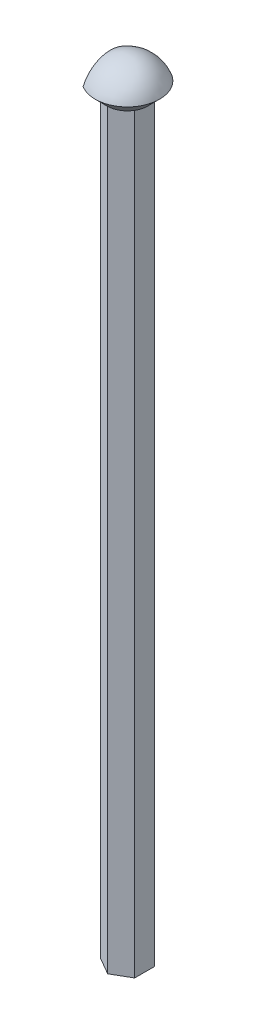
ISO-10303-21;
HEADER;
FILE_DESCRIPTION(('STEP AP214'),'2;1');
FILE_NAME('part.step','',(''),(''),'','','');
FILE_SCHEMA(('AUTOMOTIVE_DESIGN { 1 0 10303 214 1 1 1 1 }'));
ENDSEC;
DATA;
#1=APPLICATION_CONTEXT('core data for automotive mechanical design processes');
#2=APPLICATION_PROTOCOL_DEFINITION('international standard','automotive_design',2000,#1);
#3=PRODUCT_CONTEXT('',#1,'mechanical');
#4=PRODUCT('Part','Part','',(#3));
#5=PRODUCT_RELATED_PRODUCT_CATEGORY('part','',(#4));
#6=PRODUCT_DEFINITION_FORMATION('','',#4);
#7=PRODUCT_DEFINITION_CONTEXT('part definition',#1,'design');
#8=PRODUCT_DEFINITION('design','',#6,#7);
#9=PRODUCT_DEFINITION_SHAPE('','',#8);
#10=(LENGTH_UNIT() NAMED_UNIT(*) SI_UNIT(.MILLI.,.METRE.));
#11=(NAMED_UNIT(*) PLANE_ANGLE_UNIT() SI_UNIT($,.RADIAN.));
#12=(NAMED_UNIT(*) SI_UNIT($,.STERADIAN.) SOLID_ANGLE_UNIT());
#13=UNCERTAINTY_MEASURE_WITH_UNIT(LENGTH_MEASURE(1.E-05),#10,'distance_accuracy_value','');
#14=(GEOMETRIC_REPRESENTATION_CONTEXT(3) GLOBAL_UNCERTAINTY_ASSIGNED_CONTEXT((#13)) GLOBAL_UNIT_ASSIGNED_CONTEXT((#10,
#11,#12)) REPRESENTATION_CONTEXT('',''));
#15=CARTESIAN_POINT('',(0.,0.,0.));
#16=DIRECTION('',(0.,0.,1.));
#17=DIRECTION('',(1.,0.,0.));
#18=AXIS2_PLACEMENT_3D('',#15,#16,#17);
#19=CARTESIAN_POINT('',(3.17499999999997,139.7,-1.8330871046771));
#20=DIRECTION('',(-0.499999999999995,0.,0.866025403784442));
#21=DIRECTION('',(0.866025403784442,0.,0.499999999999995));
#22=AXIS2_PLACEMENT_3D('',#19,#20,#21);
#23=PLANE('',#22);
#24=DIRECTION('',(-0.866025403784441,0.,-0.499999999999995));
#25=VECTOR('',#24,1.);
#26=CARTESIAN_POINT('',(3.17499999999997,0.,-1.8330871046771));
#27=LINE('',#26,#25);
#28=CARTESIAN_POINT('',(3.17499999999997,0.,-1.8330871046771));
#29=VERTEX_POINT('',#28);
#30=CARTESIAN_POINT('',(0.,0.,-3.66617420935412));
#31=VERTEX_POINT('',#30);
#32=EDGE_CURVE('E152',#29,#31,#27,.T.);
#33=ORIENTED_EDGE('',*,*,#32,.T.);
#34=DIRECTION('',(0.,-1.,0.));
#35=VECTOR('',#34,1.);
#36=CARTESIAN_POINT('',(0.,139.7,-3.66617420935412));
#37=LINE('',#36,#35);
#38=CARTESIAN_POINT('',(0.,139.7,-3.66617420935412));
#39=VERTEX_POINT('',#38);
#40=EDGE_CURVE('E125',#39,#31,#37,.T.);
#41=ORIENTED_EDGE('',*,*,#40,.F.);
#42=DIRECTION('',(-0.866025403784441,0.,-0.499999999999995));
#43=VECTOR('',#42,1.);
#44=CARTESIAN_POINT('',(3.17499999999997,139.7,-1.8330871046771));
#45=LINE('',#44,#43);
#46=CARTESIAN_POINT('',(3.17499999999997,139.7,-1.8330871046771));
#47=VERTEX_POINT('',#46);
#48=EDGE_CURVE('E143',#47,#39,#45,.T.);
#49=ORIENTED_EDGE('',*,*,#48,.F.);
#50=DIRECTION('',(0.,-1.,0.));
#51=VECTOR('',#50,1.);
#52=CARTESIAN_POINT('',(3.17499999999997,139.7,-1.8330871046771));
#53=LINE('',#52,#51);
#54=EDGE_CURVE('E139',#47,#29,#53,.T.);
#55=ORIENTED_EDGE('',*,*,#54,.T.);
#56=EDGE_LOOP('',(#33,#41,#49,#55));
#57=FACE_BOUND('',#56,.T.);
#58=ADVANCED_FACE('F33',(#57),#23,.F.);
#59=CARTESIAN_POINT('',(0.,139.7,-3.66617420935412));
#60=DIRECTION('',(0.500000000000001,0.,0.866025403784438));
#61=DIRECTION('',(0.866025403784438,0.,-0.500000000000001));
#62=AXIS2_PLACEMENT_3D('',#59,#60,#61);
#63=PLANE('',#62);
#64=DIRECTION('',(-0.866025403784438,0.,0.500000000000001));
#65=VECTOR('',#64,1.);
#66=CARTESIAN_POINT('',(0.,0.,-3.66617420935412));
#67=LINE('',#66,#65);
#68=CARTESIAN_POINT('',(-3.175,0.,-1.83308710467705));
#69=VERTEX_POINT('',#68);
#70=EDGE_CURVE('E150',#31,#69,#67,.T.);
#71=ORIENTED_EDGE('',*,*,#70,.T.);
#72=DIRECTION('',(0.,-1.,0.));
#73=VECTOR('',#72,1.);
#74=CARTESIAN_POINT('',(-3.175,139.7,-1.83308710467705));
#75=LINE('',#74,#73);
#76=CARTESIAN_POINT('',(-3.175,139.7,-1.83308710467705));
#77=VERTEX_POINT('',#76);
#78=EDGE_CURVE('E127',#77,#69,#75,.T.);
#79=ORIENTED_EDGE('',*,*,#78,.F.);
#80=DIRECTION('',(-0.866025403784438,0.,0.500000000000001));
#81=VECTOR('',#80,1.);
#82=CARTESIAN_POINT('',(0.,139.7,-3.66617420935412));
#83=LINE('',#82,#81);
#84=EDGE_CURVE('E95',#39,#77,#83,.T.);
#85=ORIENTED_EDGE('',*,*,#84,.F.);
#86=ORIENTED_EDGE('',*,*,#40,.T.);
#87=EDGE_LOOP('',(#71,#79,#85,#86));
#88=FACE_BOUND('',#87,.T.);
#89=ADVANCED_FACE('F171',(#88),#63,.F.);
#90=CARTESIAN_POINT('',(-3.175,139.7,-1.83308710467705));
#91=DIRECTION('',(1.,0.,0.));
#92=DIRECTION('',(0.,0.,-1.));
#93=AXIS2_PLACEMENT_3D('',#90,#91,#92);
#94=PLANE('',#93);
#95=DIRECTION('',(0.,0.,1.));
#96=VECTOR('',#95,1.);
#97=CARTESIAN_POINT('',(-3.175,0.,-1.83308710467705));
#98=LINE('',#97,#96);
#99=CARTESIAN_POINT('',(-3.17499999999999,0.,1.83308710467707));
#100=VERTEX_POINT('',#99);
#101=EDGE_CURVE('E148',#69,#100,#98,.T.);
#102=ORIENTED_EDGE('',*,*,#101,.T.);
#103=DIRECTION('',(0.,-1.,0.));
#104=VECTOR('',#103,1.);
#105=CARTESIAN_POINT('',(-3.17499999999999,139.7,1.83308710467707));
#106=LINE('',#105,#104);
#107=CARTESIAN_POINT('',(-3.175,139.7,1.83308710467707));
#108=VERTEX_POINT('',#107);
#109=EDGE_CURVE('E132',#108,#100,#106,.T.);
#110=ORIENTED_EDGE('',*,*,#109,.F.);
#111=DIRECTION('',(0.,0.,-1.));
#112=VECTOR('',#111,1.);
#113=CARTESIAN_POINT('',(-3.175,139.7,0.));
#114=LINE('',#113,#112);
#115=CARTESIAN_POINT('',(-3.175,139.7,2.10605674187566));
#116=VERTEX_POINT('',#115);
#117=EDGE_CURVE('E53',#116,#108,#114,.T.);
#118=ORIENTED_EDGE('',*,*,#117,.F.);
#119=CARTESIAN_POINT('',(-3.175,149.142733211741,-12.8667910755397));
#120=CARTESIAN_POINT('',(-3.175,148.839290834502,-12.5542267812878));
#121=CARTESIAN_POINT('',(-3.175,148.53615547368,-12.2413633914042));
#122=CARTESIAN_POINT('',(-3.175,147.930699867798,-11.6148376192342));
#123=CARTESIAN_POINT('',(-3.175,147.628379638268,-11.3011752219432));
#124=CARTESIAN_POINT('',(-3.175,147.02447949178,-10.6725633026376));
#125=CARTESIAN_POINT('',(-3.175,146.722900553875,-10.3576128394072));
#126=CARTESIAN_POINT('',(-3.175,146.121086574898,-9.72643689569053));
#127=CARTESIAN_POINT('',(-3.175,145.820851517944,-9.41021143035687));
#128=CARTESIAN_POINT('',(-3.175,145.214506887757,-8.76797153920887));
#129=CARTESIAN_POINT('',(-3.175,144.90844338654,-8.4419135538011));
#130=CARTESIAN_POINT('',(-3.175,144.298896237191,-7.78737066830817));
#131=CARTESIAN_POINT('',(-3.175,143.99541268197,-7.45888568160976));
#132=CARTESIAN_POINT('',(-3.175,143.392302792378,-6.79868361249068));
#133=CARTESIAN_POINT('',(-3.175,143.092674580572,-6.46696825301267));
#134=CARTESIAN_POINT('',(-3.175,142.647484694358,-5.96563467382029));
#135=CARTESIAN_POINT('',(-3.175,142.499801027837,-5.79790164574139));
#136=CARTESIAN_POINT('',(-3.175,142.206234747448,-5.46086830764075));
#137=CARTESIAN_POINT('',(-3.175,142.060352100844,-5.29156802620301));
#138=CARTESIAN_POINT('',(-3.175,141.820245112364,-5.00905832082621));
#139=CARTESIAN_POINT('',(-3.175,141.725366248904,-4.89640531710202));
#140=CARTESIAN_POINT('',(-3.175,141.536811609472,-4.67009395754332));
#141=CARTESIAN_POINT('',(-3.175,141.443135843193,-4.55643559362207));
#142=CARTESIAN_POINT('',(-3.175,141.257192147843,-4.32787999249293));
#143=CARTESIAN_POINT('',(-3.175,141.164924920504,-4.2129821835044));
#144=CARTESIAN_POINT('',(-3.175,140.982168977094,-3.98178052702298));
#145=CARTESIAN_POINT('',(-3.175,140.89168023516,-3.8654767000159));
#146=CARTESIAN_POINT('',(-3.175,140.713185616943,-3.63155531611713));
#147=CARTESIAN_POINT('',(-3.175,140.625172803968,-3.5139430659962));
#148=CARTESIAN_POINT('',(-3.175,140.451896579546,-3.27671221332944));
#149=CARTESIAN_POINT('',(-3.175,140.366633028428,-3.15709371317807));
#150=CARTESIAN_POINT('',(-3.175,140.199663698205,-2.91550953146184));
#151=CARTESIAN_POINT('',(-3.175,140.117955527449,-2.793545509893));
#152=CARTESIAN_POINT('',(-3.175,139.959080335315,-2.54670767771466));
#153=CARTESIAN_POINT('',(-3.175,139.881912369597,-2.42183447979634));
#154=CARTESIAN_POINT('',(-3.175,139.746687983388,-2.19101302790175));
#155=CARTESIAN_POINT('',(-3.175,139.687667948921,-2.08563193418695));
#156=CARTESIAN_POINT('',(-3.175,139.574735595444,-1.87212788721426));
#157=CARTESIAN_POINT('',(-3.175,139.520823881271,-1.76400461119253));
#158=CARTESIAN_POINT('',(-3.175,139.419566830671,-1.54487664518763));
#159=CARTESIAN_POINT('',(-3.175,139.372212589484,-1.43387611063465));
#160=CARTESIAN_POINT('',(-3.175,139.285704317719,-1.20870614774979));
#161=CARTESIAN_POINT('',(-3.175,139.24654789626,-1.09453765438062));
#162=CARTESIAN_POINT('',(-3.175,139.185488000798,-0.887283147012098));
#163=CARTESIAN_POINT('',(-3.175,139.161689719113,-0.794758520363651));
#164=CARTESIAN_POINT('',(-3.175,139.121429306772,-0.608116052558129));
#165=CARTESIAN_POINT('',(-3.175,139.10496612205,-0.513998442334754));
#166=CARTESIAN_POINT('',(-3.175,139.080212221327,-0.324935246083316));
#167=CARTESIAN_POINT('',(-3.175,139.071899761578,-0.229992548393802));
#168=CARTESIAN_POINT('',(-3.175,139.063826421529,-0.0397393828847262));
#169=CARTESIAN_POINT('',(-3.175,139.064065420167,0.0555710797093254));
#170=CARTESIAN_POINT('',(-3.175,139.073080107946,0.245758083870818));
#171=CARTESIAN_POINT('',(-3.175,139.08185377463,0.340634722889787));
#172=CARTESIAN_POINT('',(-3.175,139.107456652757,0.529284903085617));
#173=CARTESIAN_POINT('',(-3.175,139.124286463747,0.623058361630417));
#174=CARTESIAN_POINT('',(-3.175,139.165251509906,0.809277056313973));
#175=CARTESIAN_POINT('',(-3.175,139.189409055842,0.90171731996822));
#176=CARTESIAN_POINT('',(-3.175,139.244035179906,1.08469155049171));
#177=CARTESIAN_POINT('',(-3.175,139.274503859973,1.17522548654361));
#178=CARTESIAN_POINT('',(-3.175,139.348707404055,1.37574292956199));
#179=CARTESIAN_POINT('',(-3.175,139.393871982778,1.48519435218907));
#180=CARTESIAN_POINT('',(-3.175,139.490741428096,1.70118787928168));
#181=CARTESIAN_POINT('',(-3.175,139.542449496614,1.80772852817538));
#182=CARTESIAN_POINT('',(-3.175,139.651127999848,2.01831790652241));
#183=CARTESIAN_POINT('',(-3.175,139.708107902554,2.1223617127058));
#184=CARTESIAN_POINT('',(-3.175,139.826165843475,2.32806088851825));
#185=CARTESIAN_POINT('',(-3.175,139.88724325871,2.42971661806745));
#186=CARTESIAN_POINT('',(-3.175,140.013612455344,2.63247647069532));
#187=CARTESIAN_POINT('',(-3.175,140.078953517355,2.73354973684742));
#188=CARTESIAN_POINT('',(-3.175,140.212351644064,2.93388491667306));
#189=CARTESIAN_POINT('',(-3.175,140.280408789494,3.03314677637624));
#190=CARTESIAN_POINT('',(-3.175,140.418649315298,3.23000717987781));
#191=CARTESIAN_POINT('',(-3.175,140.488830210765,3.32760747354615));
#192=CARTESIAN_POINT('',(-3.175,140.630999139585,3.52147365460613));
#193=CARTESIAN_POINT('',(-3.175,140.70298710642,3.61773959091323));
#194=CARTESIAN_POINT('',(-3.175,140.941680754389,3.93180690642794));
#195=CARTESIAN_POINT('',(-3.175,141.111519177965,4.14722725834356));
#196=CARTESIAN_POINT('',(-3.175,141.456424718159,4.57385257747679));
#197=CARTESIAN_POINT('',(-3.175,141.631492589712,4.78505692864979));
#198=CARTESIAN_POINT('',(-3.175,141.985405209733,5.20442001002409));
#199=CARTESIAN_POINT('',(-3.175,142.164251496033,5.41257743940585));
#200=CARTESIAN_POINT('',(-3.175,142.524660444536,5.82652873017564));
#201=CARTESIAN_POINT('',(-3.175,142.706223170452,6.03232253592503));
#202=CARTESIAN_POINT('',(-3.175,143.071766575259,6.44250078719092));
#203=CARTESIAN_POINT('',(-3.175,143.255751423642,6.64688151128349));
#204=CARTESIAN_POINT('',(-3.175,143.625313416209,7.05420090204385));
#205=CARTESIAN_POINT('',(-3.175,143.810890580561,7.25713955038659));
#206=CARTESIAN_POINT('',(-3.175,144.369383837403,7.86413554005346));
#207=CARTESIAN_POINT('',(-3.175,144.744159154625,8.26648149234266));
#208=CARTESIAN_POINT('',(-3.175,145.45284157764,9.02119403171428));
#209=CARTESIAN_POINT('',(-3.175,145.786393995134,9.37389485932006));
#210=CARTESIAN_POINT('',(-3.175,146.455346293916,10.0775913478129));
#211=CARTESIAN_POINT('',(-3.175,146.790746315479,10.4285868753121));
#212=CARTESIAN_POINT('',(-3.175,147.461681228509,11.1280246324016));
#213=CARTESIAN_POINT('',(-3.175,147.797211285107,11.4764715049881));
#214=CARTESIAN_POINT('',(-3.175,148.469281313824,12.172330152859));
#215=CARTESIAN_POINT('',(-3.175,148.805821193188,12.5197420177019));
#216=CARTESIAN_POINT('',(-3.175,149.142733211741,12.8667910755397));
#217=B_SPLINE_CURVE_WITH_KNOTS('',3,(#119,#120,#121,#122,#123,#124,#125,#126,#127,#128,#129,
#130,#131,#132,#133,#134,#135,#136,#137,#138,#139,#140,#141,#142,#143,#144,#145,#146,#147,#148,
#149,#150,#151,#152,#153,#154,#155,#156,#157,#158,#159,#160,#161,#162,#163,#164,#165,#166,#167,
#168,#169,#170,#171,#172,#173,#174,#175,#176,#177,#178,#179,#180,#181,#182,#183,#184,#185,#186,
#187,#188,#189,#190,#191,#192,#193,#194,#195,#196,#197,#198,#199,#200,#201,#202,#203,#204,#205,
#206,#207,#208,#209,#210,#211,#212,#213,#214,#215,#216),.UNSPECIFIED.,.F.,.F.,(4,2,2,2,2,2,2,2,
2,2,2,2,2,2,2,2,2,2,2,2,2,2,2,2,2,2,2,2,2,2,2,2,2,2,2,2,2,2,2,2,2,2,2,2,2,2,2,2,4),(0.,
1.30689164894519,2.61380802393742,3.92196886129789,5.23011419756415,6.57170635924741,
7.91334663230984,9.25430675645529,9.92474791139302,10.5951768626386,11.0370234608944,
11.4788736164363,11.9209371543325,12.3629942590732,12.8036557536844,13.2442948259589,
13.6846327538819,14.1248787675161,14.4871190643339,14.8494021977316,15.2111884381822,
15.5728690167597,15.8592221366303,16.1455340937383,16.4310801592764,16.7166221823698,
17.0020965571693,17.2875921805647,17.5739659298922,17.8603443051362,18.2152768467829,
18.5703837438345,18.926141258231,19.2818448059247,19.6428552265121,20.0038763858045,
20.3644903260641,20.7250910116294,21.54790718754,22.3708427265412,23.1941199146485,
24.0174164427795,24.8423887960845,25.6673716139744,27.3168996004016,28.7732227471627,
30.2296580298136,31.6808486880353,33.1319098997933),.UNSPECIFIED.);
#218=CARTESIAN_POINT('',(-3.175,141.86098389077,5.05687884211527));
#219=VERTEX_POINT('',#218);
#220=EDGE_CURVE('E38',#116,#219,#217,.T.);
#221=ORIENTED_EDGE('',*,*,#220,.T.);
#222=CARTESIAN_POINT('',(-3.175,139.7,0.));
#223=DIRECTION('',(1.,0.,0.));
#224=DIRECTION('',(0.,0.,-1.));
#225=AXIS2_PLACEMENT_3D('',#222,#223,#224);
#226=CIRCLE('',#225,5.49926131403119);
#227=CARTESIAN_POINT('',(-3.175,141.86098389077,-5.05687884211527));
#228=VERTEX_POINT('',#227);
#229=EDGE_CURVE('E113',#219,#228,#226,.F.);
#230=ORIENTED_EDGE('',*,*,#229,.T.);
#231=CARTESIAN_POINT('',(-3.175,139.7,-2.10605674187568));
#232=VERTEX_POINT('',#231);
#233=EDGE_CURVE('E11',#228,#232,#217,.T.);
#234=ORIENTED_EDGE('',*,*,#233,.T.);
#235=EDGE_CURVE('E155',#77,#232,#114,.T.);
#236=ORIENTED_EDGE('',*,*,#235,.F.);
#237=ORIENTED_EDGE('',*,*,#78,.T.);
#238=EDGE_LOOP('',(#102,#110,#118,#221,#230,#234,#236,#237));
#239=FACE_BOUND('',#238,.T.);
#240=ADVANCED_FACE('F112',(#239),#94,.F.);
#241=CARTESIAN_POINT('',(-3.17499999999999,139.7,1.83308710467707));
#242=DIRECTION('',(0.499999999999995,0.,-0.866025403784442));
#243=DIRECTION('',(-0.866025403784441,0.,-0.499999999999995));
#244=AXIS2_PLACEMENT_3D('',#241,#242,#243);
#245=PLANE('',#244);
#246=DIRECTION('',(0.866025403784442,0.,0.499999999999995));
#247=VECTOR('',#246,1.);
#248=CARTESIAN_POINT('',(-3.17499999999999,0.,1.83308710467707));
#249=LINE('',#248,#247);
#250=CARTESIAN_POINT('',(0.,0.,3.66617420935412));
#251=VERTEX_POINT('',#250);
#252=EDGE_CURVE('E146',#100,#251,#249,.T.);
#253=ORIENTED_EDGE('',*,*,#252,.T.);
#254=DIRECTION('',(0.,-1.,0.));
#255=VECTOR('',#254,1.);
#256=CARTESIAN_POINT('',(0.,139.7,3.66617420935412));
#257=LINE('',#256,#255);
#258=CARTESIAN_POINT('',(0.,139.7,3.66617420935412));
#259=VERTEX_POINT('',#258);
#260=EDGE_CURVE('E135',#259,#251,#257,.T.);
#261=ORIENTED_EDGE('',*,*,#260,.F.);
#262=DIRECTION('',(0.866025403784442,0.,0.499999999999995));
#263=VECTOR('',#262,1.);
#264=CARTESIAN_POINT('',(-3.17499999999999,139.7,1.83308710467707));
#265=LINE('',#264,#263);
#266=EDGE_CURVE('E161',#108,#259,#265,.T.);
#267=ORIENTED_EDGE('',*,*,#266,.F.);
#268=ORIENTED_EDGE('',*,*,#109,.T.);
#269=EDGE_LOOP('',(#253,#261,#267,#268));
#270=FACE_BOUND('',#269,.T.);
#271=ADVANCED_FACE('F179',(#270),#245,.F.);
#272=CARTESIAN_POINT('',(0.,139.7,3.66617420935412));
#273=DIRECTION('',(-0.500000000000007,0.,-0.866025403784435));
#274=DIRECTION('',(-0.866025403784435,0.,0.500000000000007));
#275=AXIS2_PLACEMENT_3D('',#272,#273,#274);
#276=PLANE('',#275);
#277=DIRECTION('',(0.866025403784435,0.,-0.500000000000007));
#278=VECTOR('',#277,1.);
#279=CARTESIAN_POINT('',(0.,0.,3.66617420935412));
#280=LINE('',#279,#278);
#281=CARTESIAN_POINT('',(3.17500000000001,0.,1.83308710467703));
#282=VERTEX_POINT('',#281);
#283=EDGE_CURVE('E144',#251,#282,#280,.T.);
#284=ORIENTED_EDGE('',*,*,#283,.T.);
#285=DIRECTION('',(0.,-1.,0.));
#286=VECTOR('',#285,1.);
#287=CARTESIAN_POINT('',(3.17500000000001,139.7,1.83308710467703));
#288=LINE('',#287,#286);
#289=CARTESIAN_POINT('',(3.17500000000001,139.7,1.83308710467703));
#290=VERTEX_POINT('',#289);
#291=EDGE_CURVE('E62',#290,#282,#288,.T.);
#292=ORIENTED_EDGE('',*,*,#291,.F.);
#293=DIRECTION('',(0.866025403784435,0.,-0.500000000000007));
#294=VECTOR('',#293,1.);
#295=CARTESIAN_POINT('',(0.,139.7,3.66617420935412));
#296=LINE('',#295,#294);
#297=EDGE_CURVE('E158',#259,#290,#296,.T.);
#298=ORIENTED_EDGE('',*,*,#297,.F.);
#299=ORIENTED_EDGE('',*,*,#260,.T.);
#300=EDGE_LOOP('',(#284,#292,#298,#299));
#301=FACE_BOUND('',#300,.T.);
#302=ADVANCED_FACE('F180',(#301),#276,.F.);
#303=CARTESIAN_POINT('',(3.17500000000001,139.7,1.83308710467703));
#304=DIRECTION('',(-1.,0.,0.));
#305=DIRECTION('',(0.,0.,1.));
#306=AXIS2_PLACEMENT_3D('',#303,#304,#305);
#307=PLANE('',#306);
#308=DIRECTION('',(0.,0.,-1.));
#309=VECTOR('',#308,1.);
#310=CARTESIAN_POINT('',(3.17500000000001,0.,1.83308710467703));
#311=LINE('',#310,#309);
#312=EDGE_CURVE('E88',#282,#29,#311,.T.);
#313=ORIENTED_EDGE('',*,*,#312,.T.);
#314=ORIENTED_EDGE('',*,*,#54,.F.);
#315=DIRECTION('',(0.,0.,-1.));
#316=VECTOR('',#315,1.);
#317=CARTESIAN_POINT('',(3.17500000000001,139.7,1.83308710467703));
#318=LINE('',#317,#316);
#319=EDGE_CURVE('E141',#290,#47,#318,.T.);
#320=ORIENTED_EDGE('',*,*,#319,.F.);
#321=ORIENTED_EDGE('',*,*,#291,.T.);
#322=EDGE_LOOP('',(#313,#314,#320,#321));
#323=FACE_BOUND('',#322,.T.);
#324=ADVANCED_FACE('F181',(#323),#307,.F.);
#325=CARTESIAN_POINT('',(0.,0.,0.));
#326=DIRECTION('',(0.,1.,0.));
#327=DIRECTION('',(0.,0.,1.));
#328=AXIS2_PLACEMENT_3D('',#325,#326,#327);
#329=PLANE('',#328);
#330=ORIENTED_EDGE('',*,*,#32,.F.);
#331=ORIENTED_EDGE('',*,*,#312,.F.);
#332=ORIENTED_EDGE('',*,*,#283,.F.);
#333=ORIENTED_EDGE('',*,*,#252,.F.);
#334=ORIENTED_EDGE('',*,*,#101,.F.);
#335=ORIENTED_EDGE('',*,*,#70,.F.);
#336=EDGE_LOOP('',(#330,#331,#332,#333,#334,#335));
#337=FACE_BOUND('',#336,.T.);
#338=ADVANCED_FACE('F174',(#337),#329,.F.);
#339=CARTESIAN_POINT('',(0.,139.7,0.));
#340=DIRECTION('',(0.,1.,0.));
#341=DIRECTION('',(0.,0.,1.));
#342=AXIS2_PLACEMENT_3D('',#339,#340,#341);
#343=PLANE('',#342);
#344=CARTESIAN_POINT('',(0.,139.7,0.));
#345=DIRECTION('',(0.,1.,0.));
#346=DIRECTION('',(0.,0.,1.));
#347=AXIS2_PLACEMENT_3D('',#344,#345,#346);
#348=CIRCLE('',#347,3.80999999999999);
#349=EDGE_CURVE('E119',#232,#116,#348,.F.);
#350=ORIENTED_EDGE('',*,*,#349,.T.);
#351=ORIENTED_EDGE('',*,*,#117,.T.);
#352=ORIENTED_EDGE('',*,*,#266,.T.);
#353=ORIENTED_EDGE('',*,*,#297,.T.);
#354=ORIENTED_EDGE('',*,*,#319,.T.);
#355=ORIENTED_EDGE('',*,*,#48,.T.);
#356=ORIENTED_EDGE('',*,*,#84,.T.);
#357=ORIENTED_EDGE('',*,*,#235,.T.);
#358=EDGE_LOOP('',(#350,#351,#352,#353,#354,#355,#356,#357));
#359=FACE_BOUND('',#358,.T.);
#360=ADVANCED_FACE('F169',(#359),#343,.F.);
#361=CARTESIAN_POINT('',(0.,139.7,0.));
#362=DIRECTION('',(0.,1.,0.));
#363=DIRECTION('',(0.,0.,1.));
#364=AXIS2_PLACEMENT_3D('',#361,#362,#363);
#365=SPHERICAL_SURFACE('',#364,6.35);
#366=ORIENTED_EDGE('',*,*,#229,.F.);
#367=CARTESIAN_POINT('',(0.,141.86098389077,0.));
#368=DIRECTION('',(0.,-1.,0.));
#369=DIRECTION('',(0.,0.,-1.));
#370=AXIS2_PLACEMENT_3D('',#367,#368,#369);
#371=CIRCLE('',#370,5.97098389076985);
#372=EDGE_CURVE('E123',#219,#228,#371,.F.);
#373=ORIENTED_EDGE('',*,*,#372,.T.);
#374=EDGE_LOOP('',(#366,#373));
#375=FACE_BOUND('',#374,.T.);
#376=ADVANCED_FACE('F122',(#375),#365,.T.);
#377=CARTESIAN_POINT('',(0.,141.86098389077,0.));
#378=DIRECTION('',(0.,1.,0.));
#379=DIRECTION('',(0.,0.,1.));
#380=AXIS2_PLACEMENT_3D('',#377,#378,#379);
#381=CONICAL_SURFACE('',#380,5.97098389076985,0.785398163397444);
#382=ORIENTED_EDGE('',*,*,#233,.F.);
#383=ORIENTED_EDGE('',*,*,#372,.F.);
#384=ORIENTED_EDGE('',*,*,#220,.F.);
#385=ORIENTED_EDGE('',*,*,#349,.F.);
#386=EDGE_LOOP('',(#382,#383,#384,#385));
#387=FACE_BOUND('',#386,.T.);
#388=ADVANCED_FACE('F35',(#387),#381,.T.);
#389=CLOSED_SHELL('',(#58,#89,#240,#271,#302,#324,#338,#360,#376,#388));
#390=MANIFOLD_SOLID_BREP('B2',#389);
#391=ADVANCED_BREP_SHAPE_REPRESENTATION('',(#18,#390),#14);
#392=SHAPE_DEFINITION_REPRESENTATION(#9,#391);
ENDSEC;
END-ISO-10303-21;
